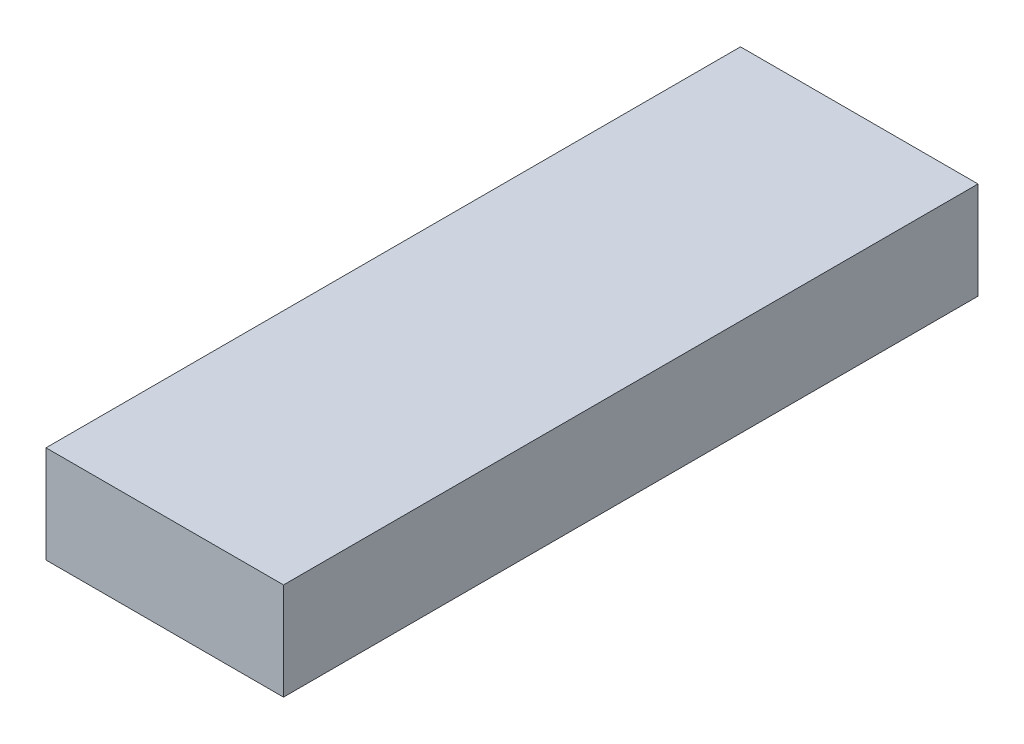
ISO-10303-21;
HEADER;
FILE_DESCRIPTION(('STEP AP214'),'2;1');
FILE_NAME('part.step','',(''),(''),'','','');
FILE_SCHEMA(('AUTOMOTIVE_DESIGN { 1 0 10303 214 1 1 1 1 }'));
ENDSEC;
DATA;
#1=APPLICATION_CONTEXT('core data for automotive mechanical design processes');
#2=APPLICATION_PROTOCOL_DEFINITION('international standard','automotive_design',2000,#1);
#3=PRODUCT_CONTEXT('',#1,'mechanical');
#4=PRODUCT('Part','Part','',(#3));
#5=PRODUCT_RELATED_PRODUCT_CATEGORY('part','',(#4));
#6=PRODUCT_DEFINITION_FORMATION('','',#4);
#7=PRODUCT_DEFINITION_CONTEXT('part definition',#1,'design');
#8=PRODUCT_DEFINITION('design','',#6,#7);
#9=PRODUCT_DEFINITION_SHAPE('','',#8);
#10=(LENGTH_UNIT() NAMED_UNIT(*) SI_UNIT(.MILLI.,.METRE.));
#11=(NAMED_UNIT(*) PLANE_ANGLE_UNIT() SI_UNIT($,.RADIAN.));
#12=(NAMED_UNIT(*) SI_UNIT($,.STERADIAN.) SOLID_ANGLE_UNIT());
#13=UNCERTAINTY_MEASURE_WITH_UNIT(LENGTH_MEASURE(1.E-05),#10,'distance_accuracy_value','');
#14=(GEOMETRIC_REPRESENTATION_CONTEXT(3) GLOBAL_UNCERTAINTY_ASSIGNED_CONTEXT((#13)) GLOBAL_UNIT_ASSIGNED_CONTEXT((#10,
#11,#12)) REPRESENTATION_CONTEXT('',''));
#15=CARTESIAN_POINT('',(0.,0.,0.));
#16=DIRECTION('',(0.,0.,1.));
#17=DIRECTION('',(1.,0.,0.));
#18=AXIS2_PLACEMENT_3D('',#15,#16,#17);
#19=CARTESIAN_POINT('',(1.71,0.7,10.));
#20=DIRECTION('',(-1.,0.,0.));
#21=DIRECTION('',(0.,-1.,0.));
#22=AXIS2_PLACEMENT_3D('',#19,#20,#21);
#23=PLANE('',#22);
#24=DIRECTION('',(0.,1.,0.));
#25=VECTOR('',#24,1.);
#26=CARTESIAN_POINT('',(1.71,0.7,0.));
#27=LINE('',#26,#25);
#28=CARTESIAN_POINT('',(1.71,-0.7,0.));
#29=VERTEX_POINT('',#28);
#30=CARTESIAN_POINT('',(1.71,0.7,0.));
#31=VERTEX_POINT('',#30);
#32=EDGE_CURVE('E96',#29,#31,#27,.T.);
#33=ORIENTED_EDGE('',*,*,#32,.T.);
#34=DIRECTION('',(0.,0.,-1.));
#35=VECTOR('',#34,1.);
#36=CARTESIAN_POINT('',(1.71,0.7,10.));
#37=LINE('',#36,#35);
#38=CARTESIAN_POINT('',(1.71,0.7,10.));
#39=VERTEX_POINT('',#38);
#40=EDGE_CURVE('E11',#39,#31,#37,.T.);
#41=ORIENTED_EDGE('',*,*,#40,.F.);
#42=DIRECTION('',(0.,1.,0.));
#43=VECTOR('',#42,1.);
#44=CARTESIAN_POINT('',(1.71,0.7,10.));
#45=LINE('',#44,#43);
#46=CARTESIAN_POINT('',(1.71,-0.7,10.));
#47=VERTEX_POINT('',#46);
#48=EDGE_CURVE('E84',#47,#39,#45,.T.);
#49=ORIENTED_EDGE('',*,*,#48,.F.);
#50=DIRECTION('',(0.,0.,-1.));
#51=VECTOR('',#50,1.);
#52=CARTESIAN_POINT('',(1.71,-0.7,10.));
#53=LINE('',#52,#51);
#54=EDGE_CURVE('E92',#47,#29,#53,.T.);
#55=ORIENTED_EDGE('',*,*,#54,.T.);
#56=EDGE_LOOP('',(#33,#41,#49,#55));
#57=FACE_BOUND('',#56,.T.);
#58=ADVANCED_FACE('F33',(#57),#23,.F.);
#59=CARTESIAN_POINT('',(-1.71,0.7,10.));
#60=DIRECTION('',(0.,-1.,0.));
#61=DIRECTION('',(0.,0.,-1.));
#62=AXIS2_PLACEMENT_3D('',#59,#60,#61);
#63=PLANE('',#62);
#64=DIRECTION('',(-1.,0.,0.));
#65=VECTOR('',#64,1.);
#66=CARTESIAN_POINT('',(-1.71,0.7,0.));
#67=LINE('',#66,#65);
#68=CARTESIAN_POINT('',(-1.71,0.7,0.));
#69=VERTEX_POINT('',#68);
#70=EDGE_CURVE('E88',#31,#69,#67,.T.);
#71=ORIENTED_EDGE('',*,*,#70,.T.);
#72=DIRECTION('',(0.,0.,-1.));
#73=VECTOR('',#72,1.);
#74=CARTESIAN_POINT('',(-1.71,0.7,10.));
#75=LINE('',#74,#73);
#76=CARTESIAN_POINT('',(-1.71,0.7,10.));
#77=VERTEX_POINT('',#76);
#78=EDGE_CURVE('E41',#77,#69,#75,.T.);
#79=ORIENTED_EDGE('',*,*,#78,.F.);
#80=DIRECTION('',(-1.,0.,0.));
#81=VECTOR('',#80,1.);
#82=CARTESIAN_POINT('',(-1.71,0.7,10.));
#83=LINE('',#82,#81);
#84=EDGE_CURVE('E79',#39,#77,#83,.T.);
#85=ORIENTED_EDGE('',*,*,#84,.F.);
#86=ORIENTED_EDGE('',*,*,#40,.T.);
#87=EDGE_LOOP('',(#71,#79,#85,#86));
#88=FACE_BOUND('',#87,.T.);
#89=ADVANCED_FACE('F87',(#88),#63,.F.);
#90=CARTESIAN_POINT('',(-1.71,0.7,10.));
#91=DIRECTION('',(1.,0.,0.));
#92=DIRECTION('',(0.,1.,0.));
#93=AXIS2_PLACEMENT_3D('',#90,#91,#92);
#94=PLANE('',#93);
#95=DIRECTION('',(0.,-1.,0.));
#96=VECTOR('',#95,1.);
#97=CARTESIAN_POINT('',(-1.71,0.7,0.));
#98=LINE('',#97,#96);
#99=CARTESIAN_POINT('',(-1.71,-0.7,0.));
#100=VERTEX_POINT('',#99);
#101=EDGE_CURVE('E66',#69,#100,#98,.T.);
#102=ORIENTED_EDGE('',*,*,#101,.T.);
#103=DIRECTION('',(0.,0.,-1.));
#104=VECTOR('',#103,1.);
#105=CARTESIAN_POINT('',(-1.71,-0.7,10.));
#106=LINE('',#105,#104);
#107=CARTESIAN_POINT('',(-1.71,-0.7,10.));
#108=VERTEX_POINT('',#107);
#109=EDGE_CURVE('E89',#108,#100,#106,.T.);
#110=ORIENTED_EDGE('',*,*,#109,.F.);
#111=DIRECTION('',(0.,-1.,0.));
#112=VECTOR('',#111,1.);
#113=CARTESIAN_POINT('',(-1.71,0.7,10.));
#114=LINE('',#113,#112);
#115=EDGE_CURVE('E82',#77,#108,#114,.T.);
#116=ORIENTED_EDGE('',*,*,#115,.F.);
#117=ORIENTED_EDGE('',*,*,#78,.T.);
#118=EDGE_LOOP('',(#102,#110,#116,#117));
#119=FACE_BOUND('',#118,.T.);
#120=ADVANCED_FACE('F90',(#119),#94,.F.);
#121=CARTESIAN_POINT('',(-1.71,-0.7,10.));
#122=DIRECTION('',(0.,1.,0.));
#123=DIRECTION('',(0.,0.,1.));
#124=AXIS2_PLACEMENT_3D('',#121,#122,#123);
#125=PLANE('',#124);
#126=DIRECTION('',(1.,0.,0.));
#127=VECTOR('',#126,1.);
#128=CARTESIAN_POINT('',(-1.71,-0.7,0.));
#129=LINE('',#128,#127);
#130=EDGE_CURVE('E72',#100,#29,#129,.T.);
#131=ORIENTED_EDGE('',*,*,#130,.T.);
#132=ORIENTED_EDGE('',*,*,#54,.F.);
#133=DIRECTION('',(1.,0.,0.));
#134=VECTOR('',#133,1.);
#135=CARTESIAN_POINT('',(-1.71,-0.7,10.));
#136=LINE('',#135,#134);
#137=EDGE_CURVE('E49',#108,#47,#136,.T.);
#138=ORIENTED_EDGE('',*,*,#137,.F.);
#139=ORIENTED_EDGE('',*,*,#109,.T.);
#140=EDGE_LOOP('',(#131,#132,#138,#139));
#141=FACE_BOUND('',#140,.T.);
#142=ADVANCED_FACE('F103',(#141),#125,.F.);
#143=CARTESIAN_POINT('',(0.,0.,10.));
#144=DIRECTION('',(0.,0.,1.));
#145=DIRECTION('',(1.,0.,0.));
#146=AXIS2_PLACEMENT_3D('',#143,#144,#145);
#147=PLANE('',#146);
#148=ORIENTED_EDGE('',*,*,#48,.T.);
#149=ORIENTED_EDGE('',*,*,#84,.T.);
#150=ORIENTED_EDGE('',*,*,#115,.T.);
#151=ORIENTED_EDGE('',*,*,#137,.T.);
#152=EDGE_LOOP('',(#148,#149,#150,#151));
#153=FACE_BOUND('',#152,.T.);
#154=ADVANCED_FACE('F80',(#153),#147,.T.);
#155=CARTESIAN_POINT('',(0.,0.,0.));
#156=DIRECTION('',(0.,0.,1.));
#157=DIRECTION('',(1.,0.,0.));
#158=AXIS2_PLACEMENT_3D('',#155,#156,#157);
#159=PLANE('',#158);
#160=ORIENTED_EDGE('',*,*,#32,.F.);
#161=ORIENTED_EDGE('',*,*,#130,.F.);
#162=ORIENTED_EDGE('',*,*,#101,.F.);
#163=ORIENTED_EDGE('',*,*,#70,.F.);
#164=EDGE_LOOP('',(#160,#161,#162,#163));
#165=FACE_BOUND('',#164,.T.);
#166=ADVANCED_FACE('F106',(#165),#159,.F.);
#167=CLOSED_SHELL('',(#58,#89,#120,#142,#154,#166));
#168=MANIFOLD_SOLID_BREP('B2',#167);
#169=ADVANCED_BREP_SHAPE_REPRESENTATION('',(#18,#168),#14);
#170=SHAPE_DEFINITION_REPRESENTATION(#9,#169);
ENDSEC;
END-ISO-10303-21;
